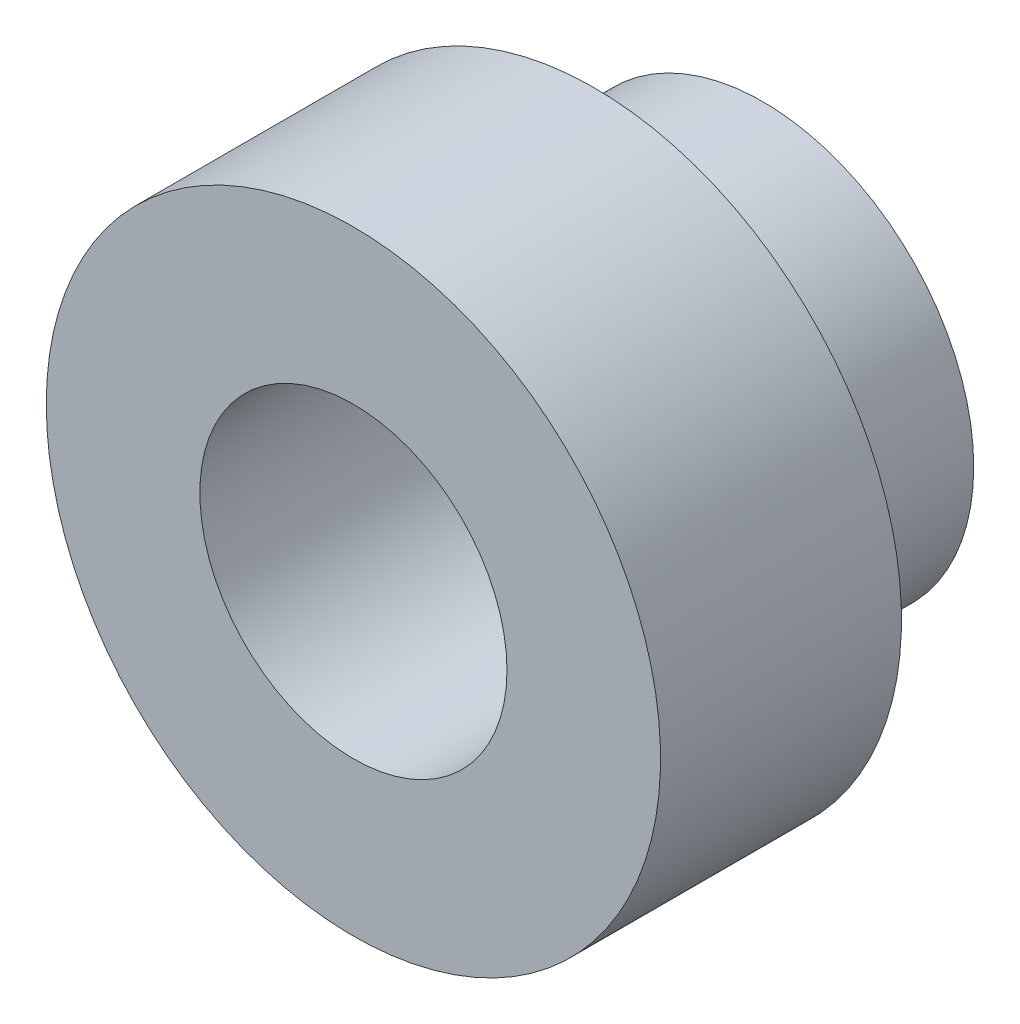
ISO-10303-21;
HEADER;
FILE_DESCRIPTION(('STEP AP214'),'2;1');
FILE_NAME('part.step','',(''),(''),'','','');
FILE_SCHEMA(('AUTOMOTIVE_DESIGN { 1 0 10303 214 1 1 1 1 }'));
ENDSEC;
DATA;
#1=APPLICATION_CONTEXT('core data for automotive mechanical design processes');
#2=APPLICATION_PROTOCOL_DEFINITION('international standard','automotive_design',2000,#1);
#3=PRODUCT_CONTEXT('',#1,'mechanical');
#4=PRODUCT('Part','Part','',(#3));
#5=PRODUCT_RELATED_PRODUCT_CATEGORY('part','',(#4));
#6=PRODUCT_DEFINITION_FORMATION('','',#4);
#7=PRODUCT_DEFINITION_CONTEXT('part definition',#1,'design');
#8=PRODUCT_DEFINITION('design','',#6,#7);
#9=PRODUCT_DEFINITION_SHAPE('','',#8);
#10=(LENGTH_UNIT() NAMED_UNIT(*) SI_UNIT(.MILLI.,.METRE.));
#11=(NAMED_UNIT(*) PLANE_ANGLE_UNIT() SI_UNIT($,.RADIAN.));
#12=(NAMED_UNIT(*) SI_UNIT($,.STERADIAN.) SOLID_ANGLE_UNIT());
#13=UNCERTAINTY_MEASURE_WITH_UNIT(LENGTH_MEASURE(1.E-05),#10,'distance_accuracy_value','');
#14=(GEOMETRIC_REPRESENTATION_CONTEXT(3) GLOBAL_UNCERTAINTY_ASSIGNED_CONTEXT((#13)) GLOBAL_UNIT_ASSIGNED_CONTEXT((#10,
#11,#12)) REPRESENTATION_CONTEXT('',''));
#15=CARTESIAN_POINT('',(0.,0.,0.));
#16=DIRECTION('',(0.,0.,1.));
#17=DIRECTION('',(1.,0.,0.));
#18=AXIS2_PLACEMENT_3D('',#15,#16,#17);
#19=CARTESIAN_POINT('',(0.,0.,0.));
#20=DIRECTION('',(0.,0.,-1.));
#21=DIRECTION('',(-1.,0.,0.));
#22=AXIS2_PLACEMENT_3D('',#19,#20,#21);
#23=PLANE('',#22);
#24=CARTESIAN_POINT('',(0.,0.,0.));
#25=DIRECTION('',(0.,0.,-1.));
#26=DIRECTION('',(-1.,0.,0.));
#27=AXIS2_PLACEMENT_3D('',#24,#25,#26);
#28=CIRCLE('',#27,1.75);
#29=CARTESIAN_POINT('',(-1.75,0.,0.));
#30=VERTEX_POINT('',#29);
#31=EDGE_CURVE('E44',#30,#30,#28,.T.);
#32=ORIENTED_EDGE('',*,*,#31,.T.);
#33=EDGE_LOOP('',(#32));
#34=FACE_BOUND('',#33,.T.);
#35=CARTESIAN_POINT('',(0.,0.,0.));
#36=DIRECTION('',(0.,0.,1.));
#37=DIRECTION('',(1.,0.,0.));
#38=AXIS2_PLACEMENT_3D('',#35,#36,#37);
#39=CIRCLE('',#38,1.27500000000001);
#40=CARTESIAN_POINT('',(1.27500000000001,0.,0.));
#41=VERTEX_POINT('',#40);
#42=EDGE_CURVE('E57',#41,#41,#39,.T.);
#43=ORIENTED_EDGE('',*,*,#42,.T.);
#44=EDGE_LOOP('',(#43));
#45=FACE_BOUND('',#44,.T.);
#46=ADVANCED_FACE('F37',(#34,#45),#23,.T.);
#47=CARTESIAN_POINT('',(0.,0.,2.));
#48=DIRECTION('',(0.,0.,-1.));
#49=DIRECTION('',(-1.,0.,0.));
#50=AXIS2_PLACEMENT_3D('',#47,#48,#49);
#51=CYLINDRICAL_SURFACE('',#50,2.55);
#52=CARTESIAN_POINT('',(0.,0.,3.4));
#53=DIRECTION('',(0.,0.,-1.));
#54=DIRECTION('',(-1.,0.,0.));
#55=AXIS2_PLACEMENT_3D('',#52,#53,#54);
#56=CIRCLE('',#55,2.55);
#57=CARTESIAN_POINT('',(-2.55,0.,3.4));
#58=VERTEX_POINT('',#57);
#59=EDGE_CURVE('E10',#58,#58,#56,.T.);
#60=ORIENTED_EDGE('',*,*,#59,.T.);
#61=EDGE_LOOP('',(#60));
#62=FACE_BOUND('',#61,.T.);
#63=CARTESIAN_POINT('',(0.,0.,1.4));
#64=DIRECTION('',(0.,0.,-1.));
#65=DIRECTION('',(-1.,0.,0.));
#66=AXIS2_PLACEMENT_3D('',#63,#64,#65);
#67=CIRCLE('',#66,2.55);
#68=CARTESIAN_POINT('',(-2.55,0.,1.4));
#69=VERTEX_POINT('',#68);
#70=EDGE_CURVE('E52',#69,#69,#67,.T.);
#71=ORIENTED_EDGE('',*,*,#70,.F.);
#72=EDGE_LOOP('',(#71));
#73=FACE_BOUND('',#72,.T.);
#74=ADVANCED_FACE('F39',(#62,#73),#51,.T.);
#75=CARTESIAN_POINT('',(2.55,0.,3.4));
#76=DIRECTION('',(0.,0.,1.));
#77=DIRECTION('',(1.,0.,0.));
#78=AXIS2_PLACEMENT_3D('',#75,#76,#77);
#79=PLANE('',#78);
#80=CARTESIAN_POINT('',(0.,0.,3.4));
#81=DIRECTION('',(0.,0.,1.));
#82=DIRECTION('',(1.,0.,0.));
#83=AXIS2_PLACEMENT_3D('',#80,#81,#82);
#84=CIRCLE('',#83,1.27500000000001);
#85=CARTESIAN_POINT('',(1.27500000000001,0.,3.4));
#86=VERTEX_POINT('',#85);
#87=EDGE_CURVE('E60',#86,#86,#84,.T.);
#88=ORIENTED_EDGE('',*,*,#87,.F.);
#89=EDGE_LOOP('',(#88));
#90=FACE_BOUND('',#89,.T.);
#91=ORIENTED_EDGE('',*,*,#59,.F.);
#92=EDGE_LOOP('',(#91));
#93=FACE_BOUND('',#92,.T.);
#94=ADVANCED_FACE('F66',(#90,#93),#79,.T.);
#95=CARTESIAN_POINT('',(0.,0.,2.));
#96=DIRECTION('',(0.,0.,-1.));
#97=DIRECTION('',(-1.,0.,0.));
#98=AXIS2_PLACEMENT_3D('',#95,#96,#97);
#99=CYLINDRICAL_SURFACE('',#98,1.75);
#100=CARTESIAN_POINT('',(0.,0.,1.4));
#101=DIRECTION('',(0.,0.,-1.));
#102=DIRECTION('',(-1.,0.,0.));
#103=AXIS2_PLACEMENT_3D('',#100,#101,#102);
#104=CIRCLE('',#103,1.75);
#105=CARTESIAN_POINT('',(-1.75,0.,1.4));
#106=VERTEX_POINT('',#105);
#107=EDGE_CURVE('E48',#106,#106,#104,.T.);
#108=ORIENTED_EDGE('',*,*,#107,.T.);
#109=EDGE_LOOP('',(#108));
#110=FACE_BOUND('',#109,.T.);
#111=ORIENTED_EDGE('',*,*,#31,.F.);
#112=EDGE_LOOP('',(#111));
#113=FACE_BOUND('',#112,.T.);
#114=ADVANCED_FACE('F69',(#110,#113),#99,.T.);
#115=CARTESIAN_POINT('',(1.75,0.,1.4));
#116=DIRECTION('',(0.,0.,-1.));
#117=DIRECTION('',(-1.,0.,0.));
#118=AXIS2_PLACEMENT_3D('',#115,#116,#117);
#119=PLANE('',#118);
#120=ORIENTED_EDGE('',*,*,#70,.T.);
#121=EDGE_LOOP('',(#120));
#122=FACE_BOUND('',#121,.T.);
#123=ORIENTED_EDGE('',*,*,#107,.F.);
#124=EDGE_LOOP('',(#123));
#125=FACE_BOUND('',#124,.T.);
#126=ADVANCED_FACE('F75',(#122,#125),#119,.T.);
#127=CARTESIAN_POINT('',(0.,0.,3.4));
#128=DIRECTION('',(0.,0.,1.));
#129=DIRECTION('',(1.,0.,0.));
#130=AXIS2_PLACEMENT_3D('',#127,#128,#129);
#131=CYLINDRICAL_SURFACE('',#130,1.27500000000001);
#132=ORIENTED_EDGE('',*,*,#42,.F.);
#133=EDGE_LOOP('',(#132));
#134=FACE_BOUND('',#133,.T.);
#135=ORIENTED_EDGE('',*,*,#87,.T.);
#136=EDGE_LOOP('',(#135));
#137=FACE_BOUND('',#136,.T.);
#138=ADVANCED_FACE('F64',(#134,#137),#131,.F.);
#139=CLOSED_SHELL('',(#46,#74,#94,#114,#126,#138));
#140=MANIFOLD_SOLID_BREP('B2',#139);
#141=ADVANCED_BREP_SHAPE_REPRESENTATION('',(#18,#140),#14);
#142=SHAPE_DEFINITION_REPRESENTATION(#9,#141);
ENDSEC;
END-ISO-10303-21;
